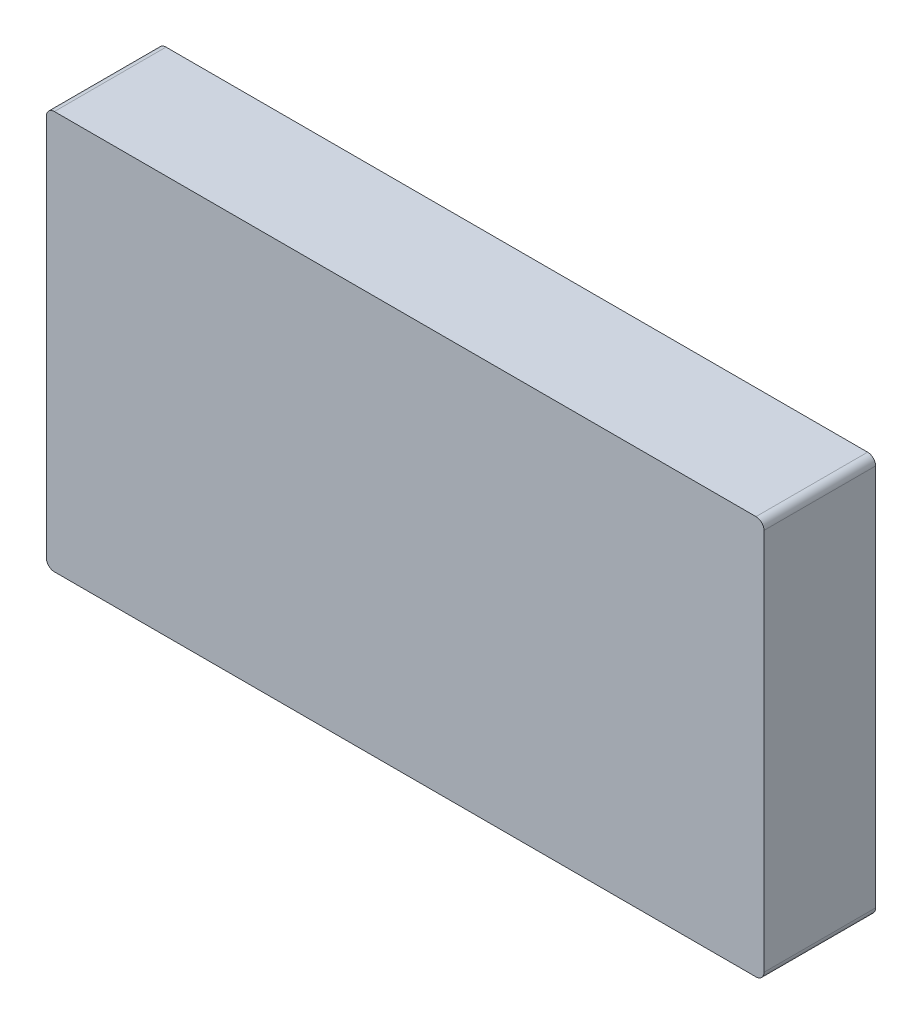
ISO-10303-21;
HEADER;
FILE_DESCRIPTION(('STEP AP214'),'2;1');
FILE_NAME('part.step','',(''),(''),'','','');
FILE_SCHEMA(('AUTOMOTIVE_DESIGN { 1 0 10303 214 1 1 1 1 }'));
ENDSEC;
DATA;
#1=APPLICATION_CONTEXT('core data for automotive mechanical design processes');
#2=APPLICATION_PROTOCOL_DEFINITION('international standard','automotive_design',2000,#1);
#3=PRODUCT_CONTEXT('',#1,'mechanical');
#4=PRODUCT('Part','Part','',(#3));
#5=PRODUCT_RELATED_PRODUCT_CATEGORY('part','',(#4));
#6=PRODUCT_DEFINITION_FORMATION('','',#4);
#7=PRODUCT_DEFINITION_CONTEXT('part definition',#1,'design');
#8=PRODUCT_DEFINITION('design','',#6,#7);
#9=PRODUCT_DEFINITION_SHAPE('','',#8);
#10=(LENGTH_UNIT() NAMED_UNIT(*) SI_UNIT(.MILLI.,.METRE.));
#11=(NAMED_UNIT(*) PLANE_ANGLE_UNIT() SI_UNIT($,.RADIAN.));
#12=(NAMED_UNIT(*) SI_UNIT($,.STERADIAN.) SOLID_ANGLE_UNIT());
#13=UNCERTAINTY_MEASURE_WITH_UNIT(LENGTH_MEASURE(1.E-05),#10,'distance_accuracy_value','');
#14=(GEOMETRIC_REPRESENTATION_CONTEXT(3) GLOBAL_UNCERTAINTY_ASSIGNED_CONTEXT((#13)) GLOBAL_UNIT_ASSIGNED_CONTEXT((#10,
#11,#12)) REPRESENTATION_CONTEXT('',''));
#15=CARTESIAN_POINT('',(0.,0.,0.));
#16=DIRECTION('',(0.,0.,1.));
#17=DIRECTION('',(1.,0.,0.));
#18=AXIS2_PLACEMENT_3D('',#15,#16,#17);
#19=CARTESIAN_POINT('',(-3.64655172413793,3.40086206896552,0.7));
#20=DIRECTION('',(1.,0.,0.));
#21=DIRECTION('',(0.,1.,0.));
#22=AXIS2_PLACEMENT_3D('',#19,#20,#21);
#23=PLANE('',#22);
#24=DIRECTION('',(0.,-1.,0.));
#25=VECTOR('',#24,1.);
#26=CARTESIAN_POINT('',(-3.64655172413793,3.40086206896552,0.7));
#27=LINE('',#26,#25);
#28=CARTESIAN_POINT('',(-3.64655172413793,3.35086206896552,0.7));
#29=VERTEX_POINT('',#28);
#30=CARTESIAN_POINT('',(-3.64655172413793,0.950862068965519,0.7));
#31=VERTEX_POINT('',#30);
#32=EDGE_CURVE('E119',#29,#31,#27,.T.);
#33=ORIENTED_EDGE('',*,*,#32,.F.);
#34=DIRECTION('',(0.,0.,-1.));
#35=VECTOR('',#34,1.);
#36=CARTESIAN_POINT('',(-3.64655172413793,3.35086206896552,0.7));
#37=LINE('',#36,#35);
#38=CARTESIAN_POINT('',(-3.64655172413793,3.35086206896552,0.));
#39=VERTEX_POINT('',#38);
#40=EDGE_CURVE('E104',#29,#39,#37,.T.);
#41=ORIENTED_EDGE('',*,*,#40,.T.);
#42=DIRECTION('',(0.,-1.,0.));
#43=VECTOR('',#42,1.);
#44=CARTESIAN_POINT('',(-3.64655172413793,3.40086206896552,0.));
#45=LINE('',#44,#43);
#46=CARTESIAN_POINT('',(-3.64655172413793,0.950862068965519,0.));
#47=VERTEX_POINT('',#46);
#48=EDGE_CURVE('E116',#39,#47,#45,.T.);
#49=ORIENTED_EDGE('',*,*,#48,.T.);
#50=DIRECTION('',(0.,0.,-1.));
#51=VECTOR('',#50,1.);
#52=CARTESIAN_POINT('',(-3.64655172413793,0.950862068965519,0.7));
#53=LINE('',#52,#51);
#54=EDGE_CURVE('E121',#47,#31,#53,.F.);
#55=ORIENTED_EDGE('',*,*,#54,.T.);
#56=EDGE_LOOP('',(#33,#41,#49,#55));
#57=FACE_BOUND('',#56,.T.);
#58=ADVANCED_FACE('F34',(#57),#23,.F.);
#59=CARTESIAN_POINT('',(-3.64655172413793,0.900862068965519,0.7));
#60=DIRECTION('',(0.,1.,0.));
#61=DIRECTION('',(0.,0.,1.));
#62=AXIS2_PLACEMENT_3D('',#59,#60,#61);
#63=PLANE('',#62);
#64=DIRECTION('',(1.,0.,0.));
#65=VECTOR('',#64,1.);
#66=CARTESIAN_POINT('',(-3.64655172413793,0.900862068965519,0.));
#67=LINE('',#66,#65);
#68=CARTESIAN_POINT('',(-3.59655172413793,0.900862068965519,0.));
#69=VERTEX_POINT('',#68);
#70=CARTESIAN_POINT('',(0.803448275862071,0.900862068965519,0.));
#71=VERTEX_POINT('',#70);
#72=EDGE_CURVE('E125',#69,#71,#67,.T.);
#73=ORIENTED_EDGE('',*,*,#72,.T.);
#74=DIRECTION('',(0.,0.,-1.));
#75=VECTOR('',#74,1.);
#76=CARTESIAN_POINT('',(0.803448275862071,0.900862068965519,0.7));
#77=LINE('',#76,#75);
#78=CARTESIAN_POINT('',(0.803448275862071,0.900862068965519,0.7));
#79=VERTEX_POINT('',#78);
#80=EDGE_CURVE('E11',#71,#79,#77,.F.);
#81=ORIENTED_EDGE('',*,*,#80,.T.);
#82=DIRECTION('',(1.,0.,0.));
#83=VECTOR('',#82,1.);
#84=CARTESIAN_POINT('',(-3.64655172413793,0.900862068965519,0.7));
#85=LINE('',#84,#83);
#86=CARTESIAN_POINT('',(-3.59655172413793,0.900862068965519,0.7));
#87=VERTEX_POINT('',#86);
#88=EDGE_CURVE('E161',#87,#79,#85,.T.);
#89=ORIENTED_EDGE('',*,*,#88,.F.);
#90=DIRECTION('',(0.,0.,-1.));
#91=VECTOR('',#90,1.);
#92=CARTESIAN_POINT('',(-3.59655172413793,0.900862068965519,0.7));
#93=LINE('',#92,#91);
#94=EDGE_CURVE('E42',#87,#69,#93,.T.);
#95=ORIENTED_EDGE('',*,*,#94,.T.);
#96=EDGE_LOOP('',(#73,#81,#89,#95));
#97=FACE_BOUND('',#96,.T.);
#98=ADVANCED_FACE('F159',(#97),#63,.F.);
#99=CARTESIAN_POINT('',(0.853448275862071,3.40086206896552,0.7));
#100=DIRECTION('',(-1.,0.,0.));
#101=DIRECTION('',(0.,-1.,0.));
#102=AXIS2_PLACEMENT_3D('',#99,#100,#101);
#103=PLANE('',#102);
#104=DIRECTION('',(0.,1.,0.));
#105=VECTOR('',#104,1.);
#106=CARTESIAN_POINT('',(0.853448275862071,3.40086206896552,0.));
#107=LINE('',#106,#105);
#108=CARTESIAN_POINT('',(0.853448275862071,0.950862068965519,0.));
#109=VERTEX_POINT('',#108);
#110=CARTESIAN_POINT('',(0.853448275862071,3.35086206896552,0.));
#111=VERTEX_POINT('',#110);
#112=EDGE_CURVE('E128',#109,#111,#107,.T.);
#113=ORIENTED_EDGE('',*,*,#112,.T.);
#114=DIRECTION('',(0.,0.,-1.));
#115=VECTOR('',#114,1.);
#116=CARTESIAN_POINT('',(0.853448275862071,3.35086206896552,0.7));
#117=LINE('',#116,#115);
#118=CARTESIAN_POINT('',(0.853448275862071,3.35086206896552,0.7));
#119=VERTEX_POINT('',#118);
#120=EDGE_CURVE('E49',#111,#119,#117,.F.);
#121=ORIENTED_EDGE('',*,*,#120,.T.);
#122=DIRECTION('',(0.,1.,0.));
#123=VECTOR('',#122,1.);
#124=CARTESIAN_POINT('',(0.853448275862071,3.40086206896552,0.7));
#125=LINE('',#124,#123);
#126=CARTESIAN_POINT('',(0.853448275862071,0.950862068965519,0.7));
#127=VERTEX_POINT('',#126);
#128=EDGE_CURVE('E169',#127,#119,#125,.T.);
#129=ORIENTED_EDGE('',*,*,#128,.F.);
#130=DIRECTION('',(0.,0.,-1.));
#131=VECTOR('',#130,1.);
#132=CARTESIAN_POINT('',(0.853448275862071,0.950862068965519,0.7));
#133=LINE('',#132,#131);
#134=EDGE_CURVE('E152',#127,#109,#133,.T.);
#135=ORIENTED_EDGE('',*,*,#134,.T.);
#136=EDGE_LOOP('',(#113,#121,#129,#135));
#137=FACE_BOUND('',#136,.T.);
#138=ADVANCED_FACE('F168',(#137),#103,.F.);
#139=CARTESIAN_POINT('',(-3.64655172413793,3.40086206896552,0.7));
#140=DIRECTION('',(0.,-1.,0.));
#141=DIRECTION('',(0.,0.,-1.));
#142=AXIS2_PLACEMENT_3D('',#139,#140,#141);
#143=PLANE('',#142);
#144=DIRECTION('',(-1.,0.,0.));
#145=VECTOR('',#144,1.);
#146=CARTESIAN_POINT('',(-3.64655172413793,3.40086206896552,0.));
#147=LINE('',#146,#145);
#148=CARTESIAN_POINT('',(0.803448275862071,3.40086206896552,0.));
#149=VERTEX_POINT('',#148);
#150=CARTESIAN_POINT('',(-3.59655172413793,3.40086206896552,0.));
#151=VERTEX_POINT('',#150);
#152=EDGE_CURVE('E135',#149,#151,#147,.T.);
#153=ORIENTED_EDGE('',*,*,#152,.T.);
#154=DIRECTION('',(0.,0.,-1.));
#155=VECTOR('',#154,1.);
#156=CARTESIAN_POINT('',(-3.59655172413793,3.40086206896552,0.7));
#157=LINE('',#156,#155);
#158=CARTESIAN_POINT('',(-3.59655172413793,3.40086206896552,0.7));
#159=VERTEX_POINT('',#158);
#160=EDGE_CURVE('E105',#151,#159,#157,.F.);
#161=ORIENTED_EDGE('',*,*,#160,.T.);
#162=DIRECTION('',(-1.,0.,0.));
#163=VECTOR('',#162,1.);
#164=CARTESIAN_POINT('',(-3.64655172413793,3.40086206896552,0.7));
#165=LINE('',#164,#163);
#166=CARTESIAN_POINT('',(0.803448275862071,3.40086206896552,0.7));
#167=VERTEX_POINT('',#166);
#168=EDGE_CURVE('E131',#167,#159,#165,.T.);
#169=ORIENTED_EDGE('',*,*,#168,.F.);
#170=DIRECTION('',(0.,0.,-1.));
#171=VECTOR('',#170,1.);
#172=CARTESIAN_POINT('',(0.803448275862071,3.40086206896552,0.7));
#173=LINE('',#172,#171);
#174=EDGE_CURVE('E110',#167,#149,#173,.T.);
#175=ORIENTED_EDGE('',*,*,#174,.T.);
#176=EDGE_LOOP('',(#153,#161,#169,#175));
#177=FACE_BOUND('',#176,.T.);
#178=ADVANCED_FACE('F197',(#177),#143,.F.);
#179=CARTESIAN_POINT('',(0.,0.,0.7));
#180=DIRECTION('',(0.,0.,1.));
#181=DIRECTION('',(1.,0.,0.));
#182=AXIS2_PLACEMENT_3D('',#179,#180,#181);
#183=PLANE('',#182);
#184=ORIENTED_EDGE('',*,*,#168,.T.);
#185=CARTESIAN_POINT('',(-3.59655172413793,3.35086206896552,0.7));
#186=DIRECTION('',(0.,0.,1.));
#187=DIRECTION('',(1.,0.,0.));
#188=AXIS2_PLACEMENT_3D('',#185,#186,#187);
#189=CIRCLE('',#188,0.05);
#190=EDGE_CURVE('E150',#159,#29,#189,.T.);
#191=ORIENTED_EDGE('',*,*,#190,.T.);
#192=ORIENTED_EDGE('',*,*,#32,.T.);
#193=CARTESIAN_POINT('',(-3.59655172413793,0.950862068965519,0.7));
#194=DIRECTION('',(0.,0.,1.));
#195=DIRECTION('',(1.,0.,0.));
#196=AXIS2_PLACEMENT_3D('',#193,#194,#195);
#197=CIRCLE('',#196,0.05);
#198=EDGE_CURVE('E145',#31,#87,#197,.T.);
#199=ORIENTED_EDGE('',*,*,#198,.T.);
#200=ORIENTED_EDGE('',*,*,#88,.T.);
#201=CARTESIAN_POINT('',(0.803448275862071,0.950862068965519,0.7));
#202=DIRECTION('',(0.,0.,1.));
#203=DIRECTION('',(1.,0.,0.));
#204=AXIS2_PLACEMENT_3D('',#201,#202,#203);
#205=CIRCLE('',#204,0.05);
#206=EDGE_CURVE('E56',#79,#127,#205,.T.);
#207=ORIENTED_EDGE('',*,*,#206,.T.);
#208=ORIENTED_EDGE('',*,*,#128,.T.);
#209=CARTESIAN_POINT('',(0.803448275862071,3.35086206896552,0.7));
#210=DIRECTION('',(0.,0.,1.));
#211=DIRECTION('',(1.,0.,0.));
#212=AXIS2_PLACEMENT_3D('',#209,#210,#211);
#213=CIRCLE('',#212,0.05);
#214=EDGE_CURVE('E148',#119,#167,#213,.T.);
#215=ORIENTED_EDGE('',*,*,#214,.T.);
#216=EDGE_LOOP('',(#184,#191,#192,#199,#200,#207,#208,#215));
#217=FACE_BOUND('',#216,.T.);
#218=ADVANCED_FACE('F174',(#217),#183,.T.);
#219=CARTESIAN_POINT('',(0.,0.,0.));
#220=DIRECTION('',(0.,0.,1.));
#221=DIRECTION('',(1.,0.,0.));
#222=AXIS2_PLACEMENT_3D('',#219,#220,#221);
#223=PLANE('',#222);
#224=ORIENTED_EDGE('',*,*,#48,.F.);
#225=CARTESIAN_POINT('',(-3.59655172413793,3.35086206896552,0.));
#226=DIRECTION('',(0.,0.,1.));
#227=DIRECTION('',(1.,0.,0.));
#228=AXIS2_PLACEMENT_3D('',#225,#226,#227);
#229=CIRCLE('',#228,0.05);
#230=EDGE_CURVE('E100',#39,#151,#229,.F.);
#231=ORIENTED_EDGE('',*,*,#230,.T.);
#232=ORIENTED_EDGE('',*,*,#152,.F.);
#233=CARTESIAN_POINT('',(0.803448275862071,3.35086206896552,0.));
#234=DIRECTION('',(0.,0.,1.));
#235=DIRECTION('',(1.,0.,0.));
#236=AXIS2_PLACEMENT_3D('',#233,#234,#235);
#237=CIRCLE('',#236,0.05);
#238=EDGE_CURVE('E111',#149,#111,#237,.F.);
#239=ORIENTED_EDGE('',*,*,#238,.T.);
#240=ORIENTED_EDGE('',*,*,#112,.F.);
#241=CARTESIAN_POINT('',(0.803448275862071,0.950862068965519,0.));
#242=DIRECTION('',(0.,0.,1.));
#243=DIRECTION('',(1.,0.,0.));
#244=AXIS2_PLACEMENT_3D('',#241,#242,#243);
#245=CIRCLE('',#244,0.05);
#246=EDGE_CURVE('E139',#109,#71,#245,.F.);
#247=ORIENTED_EDGE('',*,*,#246,.T.);
#248=ORIENTED_EDGE('',*,*,#72,.F.);
#249=CARTESIAN_POINT('',(-3.59655172413793,0.950862068965519,0.));
#250=DIRECTION('',(0.,0.,1.));
#251=DIRECTION('',(1.,0.,0.));
#252=AXIS2_PLACEMENT_3D('',#249,#250,#251);
#253=CIRCLE('',#252,0.05);
#254=EDGE_CURVE('E120',#69,#47,#253,.F.);
#255=ORIENTED_EDGE('',*,*,#254,.T.);
#256=EDGE_LOOP('',(#224,#231,#232,#239,#240,#247,#248,#255));
#257=FACE_BOUND('',#256,.T.);
#258=ADVANCED_FACE('F123',(#257),#223,.F.);
#259=CARTESIAN_POINT('',(-3.59655172413793,3.35086206896552,0.7));
#260=DIRECTION('',(0.,0.,-1.));
#261=DIRECTION('',(-1.,0.,0.));
#262=AXIS2_PLACEMENT_3D('',#259,#260,#261);
#263=CYLINDRICAL_SURFACE('',#262,0.05);
#264=ORIENTED_EDGE('',*,*,#190,.F.);
#265=ORIENTED_EDGE('',*,*,#160,.F.);
#266=ORIENTED_EDGE('',*,*,#230,.F.);
#267=ORIENTED_EDGE('',*,*,#40,.F.);
#268=EDGE_LOOP('',(#264,#265,#266,#267));
#269=FACE_BOUND('',#268,.T.);
#270=ADVANCED_FACE('F103',(#269),#263,.T.);
#271=CARTESIAN_POINT('',(0.803448275862071,3.35086206896552,0.7));
#272=DIRECTION('',(0.,0.,-1.));
#273=DIRECTION('',(-1.,0.,0.));
#274=AXIS2_PLACEMENT_3D('',#271,#272,#273);
#275=CYLINDRICAL_SURFACE('',#274,0.05);
#276=ORIENTED_EDGE('',*,*,#214,.F.);
#277=ORIENTED_EDGE('',*,*,#120,.F.);
#278=ORIENTED_EDGE('',*,*,#238,.F.);
#279=ORIENTED_EDGE('',*,*,#174,.F.);
#280=EDGE_LOOP('',(#276,#277,#278,#279));
#281=FACE_BOUND('',#280,.T.);
#282=ADVANCED_FACE('F179',(#281),#275,.T.);
#283=CARTESIAN_POINT('',(0.803448275862071,0.950862068965519,0.7));
#284=DIRECTION('',(0.,0.,-1.));
#285=DIRECTION('',(-1.,0.,0.));
#286=AXIS2_PLACEMENT_3D('',#283,#284,#285);
#287=CYLINDRICAL_SURFACE('',#286,0.05);
#288=ORIENTED_EDGE('',*,*,#206,.F.);
#289=ORIENTED_EDGE('',*,*,#80,.F.);
#290=ORIENTED_EDGE('',*,*,#246,.F.);
#291=ORIENTED_EDGE('',*,*,#134,.F.);
#292=EDGE_LOOP('',(#288,#289,#290,#291));
#293=FACE_BOUND('',#292,.T.);
#294=ADVANCED_FACE('F167',(#293),#287,.T.);
#295=CARTESIAN_POINT('',(-3.59655172413793,0.950862068965519,0.7));
#296=DIRECTION('',(0.,0.,-1.));
#297=DIRECTION('',(-1.,0.,0.));
#298=AXIS2_PLACEMENT_3D('',#295,#296,#297);
#299=CYLINDRICAL_SURFACE('',#298,0.05);
#300=ORIENTED_EDGE('',*,*,#198,.F.);
#301=ORIENTED_EDGE('',*,*,#54,.F.);
#302=ORIENTED_EDGE('',*,*,#254,.F.);
#303=ORIENTED_EDGE('',*,*,#94,.F.);
#304=EDGE_LOOP('',(#300,#301,#302,#303));
#305=FACE_BOUND('',#304,.T.);
#306=ADVANCED_FACE('F36',(#305),#299,.T.);
#307=CLOSED_SHELL('',(#58,#98,#138,#178,#218,#258,#270,#282,#294,#306));
#308=MANIFOLD_SOLID_BREP('B2',#307);
#309=ADVANCED_BREP_SHAPE_REPRESENTATION('',(#18,#308),#14);
#310=SHAPE_DEFINITION_REPRESENTATION(#9,#309);
ENDSEC;
END-ISO-10303-21;
